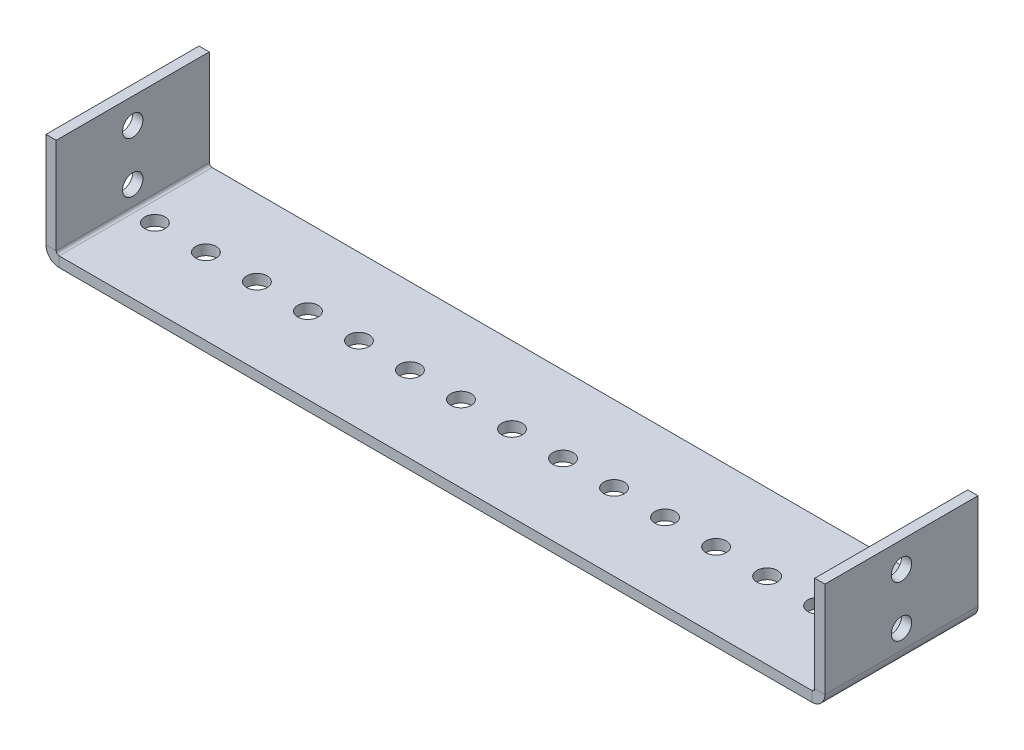
ISO-10303-21;
HEADER;
FILE_DESCRIPTION(('STEP AP214'),'2;1');
FILE_NAME('part.step','',(''),(''),'','','');
FILE_SCHEMA(('AUTOMOTIVE_DESIGN { 1 0 10303 214 1 1 1 1 }'));
ENDSEC;
DATA;
#1=APPLICATION_CONTEXT('core data for automotive mechanical design processes');
#2=APPLICATION_PROTOCOL_DEFINITION('international standard','automotive_design',2000,#1);
#3=PRODUCT_CONTEXT('',#1,'mechanical');
#4=PRODUCT('Part','Part','',(#3));
#5=PRODUCT_RELATED_PRODUCT_CATEGORY('part','',(#4));
#6=PRODUCT_DEFINITION_FORMATION('','',#4);
#7=PRODUCT_DEFINITION_CONTEXT('part definition',#1,'design');
#8=PRODUCT_DEFINITION('design','',#6,#7);
#9=PRODUCT_DEFINITION_SHAPE('','',#8);
#10=(LENGTH_UNIT() NAMED_UNIT(*) SI_UNIT(.MILLI.,.METRE.));
#11=(NAMED_UNIT(*) PLANE_ANGLE_UNIT() SI_UNIT($,.RADIAN.));
#12=(NAMED_UNIT(*) SI_UNIT($,.STERADIAN.) SOLID_ANGLE_UNIT());
#13=UNCERTAINTY_MEASURE_WITH_UNIT(LENGTH_MEASURE(1.E-05),#10,'distance_accuracy_value','');
#14=(GEOMETRIC_REPRESENTATION_CONTEXT(3) GLOBAL_UNCERTAINTY_ASSIGNED_CONTEXT((#13)) GLOBAL_UNIT_ASSIGNED_CONTEXT((#10,
#11,#12)) REPRESENTATION_CONTEXT('',''));
#15=CARTESIAN_POINT('',(0.,0.,0.));
#16=DIRECTION('',(0.,0.,1.));
#17=DIRECTION('',(1.,0.,0.));
#18=AXIS2_PLACEMENT_3D('',#15,#16,#17);
#19=CARTESIAN_POINT('',(-120.65,2.54,-19.05));
#20=DIRECTION('',(0.,0.,1.));
#21=DIRECTION('',(1.,0.,0.));
#22=AXIS2_PLACEMENT_3D('',#19,#20,#21);
#23=PLANE('',#22);
#24=DIRECTION('',(-1.,0.,0.));
#25=VECTOR('',#24,1.);
#26=CARTESIAN_POINT('',(-120.65,2.54,-19.05));
#27=LINE('',#26,#25);
#28=CARTESIAN_POINT('',(93.6740200453267,2.54,-19.05));
#29=VERTEX_POINT('',#28);
#30=CARTESIAN_POINT('',(-93.6740200453267,2.54,-19.05));
#31=VERTEX_POINT('',#30);
#32=EDGE_CURVE('E370',#29,#31,#27,.T.);
#33=ORIENTED_EDGE('',*,*,#32,.F.);
#34=DIRECTION('',(0.,-1.,0.));
#35=VECTOR('',#34,1.);
#36=CARTESIAN_POINT('',(93.6740200453267,2.54,-19.05));
#37=LINE('',#36,#35);
#38=CARTESIAN_POINT('',(93.6740200453266,0.,-19.05));
#39=VERTEX_POINT('',#38);
#40=EDGE_CURVE('E12',#29,#39,#37,.T.);
#41=ORIENTED_EDGE('',*,*,#40,.T.);
#42=DIRECTION('',(-1.,0.,0.));
#43=VECTOR('',#42,1.);
#44=CARTESIAN_POINT('',(-120.65,0.,-19.05));
#45=LINE('',#44,#43);
#46=CARTESIAN_POINT('',(-93.6740200453267,0.,-19.05));
#47=VERTEX_POINT('',#46);
#48=EDGE_CURVE('E219',#39,#47,#45,.T.);
#49=ORIENTED_EDGE('',*,*,#48,.T.);
#50=DIRECTION('',(0.,-1.,0.));
#51=VECTOR('',#50,1.);
#52=CARTESIAN_POINT('',(-93.6740200453267,2.54,-19.05));
#53=LINE('',#52,#51);
#54=EDGE_CURVE('E314',#31,#47,#53,.T.);
#55=ORIENTED_EDGE('',*,*,#54,.F.);
#56=EDGE_LOOP('',(#33,#41,#49,#55));
#57=FACE_BOUND('',#56,.T.);
#58=ADVANCED_FACE('F47',(#57),#23,.F.);
#59=CARTESIAN_POINT('',(-120.65,2.54,19.05));
#60=DIRECTION('',(0.,0.,-1.));
#61=DIRECTION('',(-1.,0.,0.));
#62=AXIS2_PLACEMENT_3D('',#59,#60,#61);
#63=PLANE('',#62);
#64=DIRECTION('',(1.,0.,0.));
#65=VECTOR('',#64,1.);
#66=CARTESIAN_POINT('',(-120.65,0.,19.05));
#67=LINE('',#66,#65);
#68=CARTESIAN_POINT('',(-93.6740200453267,0.,19.05));
#69=VERTEX_POINT('',#68);
#70=CARTESIAN_POINT('',(93.6740200453267,0.,19.05));
#71=VERTEX_POINT('',#70);
#72=EDGE_CURVE('E265',#69,#71,#67,.T.);
#73=ORIENTED_EDGE('',*,*,#72,.T.);
#74=DIRECTION('',(0.,1.,0.));
#75=VECTOR('',#74,1.);
#76=CARTESIAN_POINT('',(93.6740200453267,2.54,19.05));
#77=LINE('',#76,#75);
#78=CARTESIAN_POINT('',(93.6740200453267,2.54,19.05));
#79=VERTEX_POINT('',#78);
#80=EDGE_CURVE('E364',#71,#79,#77,.T.);
#81=ORIENTED_EDGE('',*,*,#80,.T.);
#82=DIRECTION('',(1.,0.,0.));
#83=VECTOR('',#82,1.);
#84=CARTESIAN_POINT('',(-120.65,2.54,19.05));
#85=LINE('',#84,#83);
#86=CARTESIAN_POINT('',(-93.6740200453267,2.54,19.05));
#87=VERTEX_POINT('',#86);
#88=EDGE_CURVE('E50',#87,#79,#85,.T.);
#89=ORIENTED_EDGE('',*,*,#88,.F.);
#90=DIRECTION('',(0.,1.,0.));
#91=VECTOR('',#90,1.);
#92=CARTESIAN_POINT('',(-93.6740200453267,2.54,19.05));
#93=LINE('',#92,#91);
#94=EDGE_CURVE('E311',#69,#87,#93,.T.);
#95=ORIENTED_EDGE('',*,*,#94,.F.);
#96=EDGE_LOOP('',(#73,#81,#89,#95));
#97=FACE_BOUND('',#96,.T.);
#98=ADVANCED_FACE('F379',(#97),#63,.F.);
#99=CARTESIAN_POINT('',(0.,2.54,0.));
#100=DIRECTION('',(0.,-1.,0.));
#101=DIRECTION('',(0.,0.,-1.));
#102=AXIS2_PLACEMENT_3D('',#99,#100,#101);
#103=PLANE('',#102);
#104=CARTESIAN_POINT('',(88.9,2.54,0.));
#105=DIRECTION('',(0.,1.,0.));
#106=DIRECTION('',(0.,0.,1.));
#107=AXIS2_PLACEMENT_3D('',#104,#105,#106);
#108=CIRCLE('',#107,2.54);
#109=CARTESIAN_POINT('',(88.9,2.54,2.54));
#110=VERTEX_POINT('',#109);
#111=EDGE_CURVE('E308',#110,#110,#108,.T.);
#112=ORIENTED_EDGE('',*,*,#111,.F.);
#113=EDGE_LOOP('',(#112));
#114=FACE_BOUND('',#113,.T.);
#115=CARTESIAN_POINT('',(76.2,2.54,0.));
#116=DIRECTION('',(0.,1.,0.));
#117=DIRECTION('',(0.,0.,1.));
#118=AXIS2_PLACEMENT_3D('',#115,#116,#117);
#119=CIRCLE('',#118,2.54);
#120=CARTESIAN_POINT('',(76.2,2.54,2.54));
#121=VERTEX_POINT('',#120);
#122=EDGE_CURVE('E305',#121,#121,#119,.T.);
#123=ORIENTED_EDGE('',*,*,#122,.F.);
#124=EDGE_LOOP('',(#123));
#125=FACE_BOUND('',#124,.T.);
#126=CARTESIAN_POINT('',(63.5,2.54,0.));
#127=DIRECTION('',(0.,1.,0.));
#128=DIRECTION('',(0.,0.,1.));
#129=AXIS2_PLACEMENT_3D('',#126,#127,#128);
#130=CIRCLE('',#129,2.54);
#131=CARTESIAN_POINT('',(63.5,2.54,2.54));
#132=VERTEX_POINT('',#131);
#133=EDGE_CURVE('E302',#132,#132,#130,.T.);
#134=ORIENTED_EDGE('',*,*,#133,.F.);
#135=EDGE_LOOP('',(#134));
#136=FACE_BOUND('',#135,.T.);
#137=CARTESIAN_POINT('',(50.8,2.54,0.));
#138=DIRECTION('',(0.,1.,0.));
#139=DIRECTION('',(0.,0.,1.));
#140=AXIS2_PLACEMENT_3D('',#137,#138,#139);
#141=CIRCLE('',#140,2.54);
#142=CARTESIAN_POINT('',(50.8,2.54,2.54));
#143=VERTEX_POINT('',#142);
#144=EDGE_CURVE('E299',#143,#143,#141,.T.);
#145=ORIENTED_EDGE('',*,*,#144,.F.);
#146=EDGE_LOOP('',(#145));
#147=FACE_BOUND('',#146,.T.);
#148=CARTESIAN_POINT('',(38.1,2.54,0.));
#149=DIRECTION('',(0.,1.,0.));
#150=DIRECTION('',(0.,0.,1.));
#151=AXIS2_PLACEMENT_3D('',#148,#149,#150);
#152=CIRCLE('',#151,2.54);
#153=CARTESIAN_POINT('',(38.1,2.54,2.54));
#154=VERTEX_POINT('',#153);
#155=EDGE_CURVE('E296',#154,#154,#152,.T.);
#156=ORIENTED_EDGE('',*,*,#155,.F.);
#157=EDGE_LOOP('',(#156));
#158=FACE_BOUND('',#157,.T.);
#159=CARTESIAN_POINT('',(25.4,2.54,0.));
#160=DIRECTION('',(0.,1.,0.));
#161=DIRECTION('',(0.,0.,1.));
#162=AXIS2_PLACEMENT_3D('',#159,#160,#161);
#163=CIRCLE('',#162,2.54);
#164=CARTESIAN_POINT('',(25.4,2.54,2.54));
#165=VERTEX_POINT('',#164);
#166=EDGE_CURVE('E293',#165,#165,#163,.T.);
#167=ORIENTED_EDGE('',*,*,#166,.F.);
#168=EDGE_LOOP('',(#167));
#169=FACE_BOUND('',#168,.T.);
#170=CARTESIAN_POINT('',(12.7,2.54,0.));
#171=DIRECTION('',(0.,1.,0.));
#172=DIRECTION('',(0.,0.,1.));
#173=AXIS2_PLACEMENT_3D('',#170,#171,#172);
#174=CIRCLE('',#173,2.54);
#175=CARTESIAN_POINT('',(12.7,2.54,2.54));
#176=VERTEX_POINT('',#175);
#177=EDGE_CURVE('E290',#176,#176,#174,.T.);
#178=ORIENTED_EDGE('',*,*,#177,.F.);
#179=EDGE_LOOP('',(#178));
#180=FACE_BOUND('',#179,.T.);
#181=CARTESIAN_POINT('',(0.,2.54,0.));
#182=DIRECTION('',(0.,1.,0.));
#183=DIRECTION('',(0.,0.,1.));
#184=AXIS2_PLACEMENT_3D('',#181,#182,#183);
#185=CIRCLE('',#184,2.54);
#186=CARTESIAN_POINT('',(0.,2.54,2.54));
#187=VERTEX_POINT('',#186);
#188=EDGE_CURVE('E287',#187,#187,#185,.T.);
#189=ORIENTED_EDGE('',*,*,#188,.F.);
#190=EDGE_LOOP('',(#189));
#191=FACE_BOUND('',#190,.T.);
#192=CARTESIAN_POINT('',(-12.7,2.54,0.));
#193=DIRECTION('',(0.,1.,0.));
#194=DIRECTION('',(0.,0.,1.));
#195=AXIS2_PLACEMENT_3D('',#192,#193,#194);
#196=CIRCLE('',#195,2.54);
#197=CARTESIAN_POINT('',(-12.7,2.54,2.54));
#198=VERTEX_POINT('',#197);
#199=EDGE_CURVE('E284',#198,#198,#196,.T.);
#200=ORIENTED_EDGE('',*,*,#199,.F.);
#201=EDGE_LOOP('',(#200));
#202=FACE_BOUND('',#201,.T.);
#203=CARTESIAN_POINT('',(-25.4,2.54,0.));
#204=DIRECTION('',(0.,1.,0.));
#205=DIRECTION('',(0.,0.,1.));
#206=AXIS2_PLACEMENT_3D('',#203,#204,#205);
#207=CIRCLE('',#206,2.54);
#208=CARTESIAN_POINT('',(-25.4,2.54,2.54));
#209=VERTEX_POINT('',#208);
#210=EDGE_CURVE('E281',#209,#209,#207,.T.);
#211=ORIENTED_EDGE('',*,*,#210,.F.);
#212=EDGE_LOOP('',(#211));
#213=FACE_BOUND('',#212,.T.);
#214=CARTESIAN_POINT('',(-38.1,2.54,0.));
#215=DIRECTION('',(0.,1.,0.));
#216=DIRECTION('',(0.,0.,1.));
#217=AXIS2_PLACEMENT_3D('',#214,#215,#216);
#218=CIRCLE('',#217,2.54);
#219=CARTESIAN_POINT('',(-38.1,2.54,2.54));
#220=VERTEX_POINT('',#219);
#221=EDGE_CURVE('E278',#220,#220,#218,.T.);
#222=ORIENTED_EDGE('',*,*,#221,.F.);
#223=EDGE_LOOP('',(#222));
#224=FACE_BOUND('',#223,.T.);
#225=CARTESIAN_POINT('',(-50.8,2.54,0.));
#226=DIRECTION('',(0.,1.,0.));
#227=DIRECTION('',(0.,0.,1.));
#228=AXIS2_PLACEMENT_3D('',#225,#226,#227);
#229=CIRCLE('',#228,2.54);
#230=CARTESIAN_POINT('',(-50.8,2.54,2.54));
#231=VERTEX_POINT('',#230);
#232=EDGE_CURVE('E275',#231,#231,#229,.T.);
#233=ORIENTED_EDGE('',*,*,#232,.F.);
#234=EDGE_LOOP('',(#233));
#235=FACE_BOUND('',#234,.T.);
#236=CARTESIAN_POINT('',(-63.5,2.54,0.));
#237=DIRECTION('',(0.,1.,0.));
#238=DIRECTION('',(0.,0.,1.));
#239=AXIS2_PLACEMENT_3D('',#236,#237,#238);
#240=CIRCLE('',#239,2.54);
#241=CARTESIAN_POINT('',(-63.5,2.54,2.54));
#242=VERTEX_POINT('',#241);
#243=EDGE_CURVE('E272',#242,#242,#240,.T.);
#244=ORIENTED_EDGE('',*,*,#243,.F.);
#245=EDGE_LOOP('',(#244));
#246=FACE_BOUND('',#245,.T.);
#247=CARTESIAN_POINT('',(-76.2,2.54,0.));
#248=DIRECTION('',(0.,1.,0.));
#249=DIRECTION('',(0.,0.,1.));
#250=AXIS2_PLACEMENT_3D('',#247,#248,#249);
#251=CIRCLE('',#250,2.54);
#252=CARTESIAN_POINT('',(-76.2,2.54,2.54));
#253=VERTEX_POINT('',#252);
#254=EDGE_CURVE('E269',#253,#253,#251,.T.);
#255=ORIENTED_EDGE('',*,*,#254,.F.);
#256=EDGE_LOOP('',(#255));
#257=FACE_BOUND('',#256,.T.);
#258=CARTESIAN_POINT('',(-88.9,2.54,0.));
#259=DIRECTION('',(0.,1.,0.));
#260=DIRECTION('',(0.,0.,1.));
#261=AXIS2_PLACEMENT_3D('',#258,#259,#260);
#262=CIRCLE('',#261,2.54);
#263=CARTESIAN_POINT('',(-88.9,2.54,2.54));
#264=VERTEX_POINT('',#263);
#265=EDGE_CURVE('E266',#264,#264,#262,.T.);
#266=ORIENTED_EDGE('',*,*,#265,.F.);
#267=EDGE_LOOP('',(#266));
#268=FACE_BOUND('',#267,.T.);
#269=ORIENTED_EDGE('',*,*,#88,.T.);
#270=DIRECTION('',(0.,0.,-1.));
#271=VECTOR('',#270,1.);
#272=CARTESIAN_POINT('',(93.6740200453267,2.54,0.));
#273=LINE('',#272,#271);
#274=EDGE_CURVE('E355',#79,#29,#273,.T.);
#275=ORIENTED_EDGE('',*,*,#274,.T.);
#276=ORIENTED_EDGE('',*,*,#32,.T.);
#277=DIRECTION('',(0.,0.,-1.));
#278=VECTOR('',#277,1.);
#279=CARTESIAN_POINT('',(-93.6740200453267,2.54,0.));
#280=LINE('',#279,#278);
#281=EDGE_CURVE('E212',#87,#31,#280,.T.);
#282=ORIENTED_EDGE('',*,*,#281,.F.);
#283=EDGE_LOOP('',(#269,#275,#276,#282));
#284=FACE_BOUND('',#283,.T.);
#285=ADVANCED_FACE('F376',(#114,#125,#136,#147,#158,#169,#180,#191,#202,#213,#224,#235,#246,
#257,#268,#284),#103,.F.);
#286=CARTESIAN_POINT('',(-94.410620045327,-93.5493799546733,0.));
#287=DIRECTION('',(-1.,0.,0.));
#288=DIRECTION('',(0.,0.,-1.));
#289=AXIS2_PLACEMENT_3D('',#286,#287,#288);
#290=PLANE('',#289);
#291=CARTESIAN_POINT('',(-94.4106200453266,20.7506200453267,0.));
#292=DIRECTION('',(1.,0.,0.));
#293=DIRECTION('',(0.,0.,1.));
#294=AXIS2_PLACEMENT_3D('',#291,#292,#293);
#295=CIRCLE('',#294,2.54);
#296=CARTESIAN_POINT('',(-94.4106200453266,20.7506200453267,2.54));
#297=VERTEX_POINT('',#296);
#298=EDGE_CURVE('E325',#297,#297,#295,.T.);
#299=ORIENTED_EDGE('',*,*,#298,.F.);
#300=EDGE_LOOP('',(#299));
#301=FACE_BOUND('',#300,.T.);
#302=CARTESIAN_POINT('',(-94.4106200453267,8.05062004532668,0.));
#303=DIRECTION('',(1.,0.,0.));
#304=DIRECTION('',(0.,0.,1.));
#305=AXIS2_PLACEMENT_3D('',#302,#303,#304);
#306=CIRCLE('',#305,2.54);
#307=CARTESIAN_POINT('',(-94.4106200453267,8.05062004532668,2.54));
#308=VERTEX_POINT('',#307);
#309=EDGE_CURVE('E322',#308,#308,#306,.T.);
#310=ORIENTED_EDGE('',*,*,#309,.F.);
#311=EDGE_LOOP('',(#310));
#312=FACE_BOUND('',#311,.T.);
#313=DIRECTION('',(0.,-1.,0.));
#314=VECTOR('',#313,1.);
#315=CARTESIAN_POINT('',(-94.4106200453266,27.1006200453267,19.05));
#316=LINE('',#315,#314);
#317=CARTESIAN_POINT('',(-94.4106200453266,27.1006200453267,19.05));
#318=VERTEX_POINT('',#317);
#319=CARTESIAN_POINT('',(-94.4106200453267,3.2766,19.05));
#320=VERTEX_POINT('',#319);
#321=EDGE_CURVE('E334',#318,#320,#316,.T.);
#322=ORIENTED_EDGE('',*,*,#321,.T.);
#323=DIRECTION('',(0.,0.,-1.));
#324=VECTOR('',#323,1.);
#325=CARTESIAN_POINT('',(-94.4106200453267,3.2766,0.));
#326=LINE('',#325,#324);
#327=CARTESIAN_POINT('',(-94.4106200453267,3.2766,-19.05));
#328=VERTEX_POINT('',#327);
#329=EDGE_CURVE('E345',#320,#328,#326,.T.);
#330=ORIENTED_EDGE('',*,*,#329,.T.);
#331=DIRECTION('',(0.,1.,0.));
#332=VECTOR('',#331,1.);
#333=CARTESIAN_POINT('',(-94.4106200453266,27.1006200453267,-19.05));
#334=LINE('',#333,#332);
#335=CARTESIAN_POINT('',(-94.4106200453266,27.1006200453267,-19.05));
#336=VERTEX_POINT('',#335);
#337=EDGE_CURVE('E335',#328,#336,#334,.T.);
#338=ORIENTED_EDGE('',*,*,#337,.T.);
#339=DIRECTION('',(0.,0.,1.));
#340=VECTOR('',#339,1.);
#341=CARTESIAN_POINT('',(-94.4106200453266,27.1006200453267,19.05));
#342=LINE('',#341,#340);
#343=EDGE_CURVE('E332',#336,#318,#342,.T.);
#344=ORIENTED_EDGE('',*,*,#343,.T.);
#345=EDGE_LOOP('',(#322,#330,#338,#344));
#346=FACE_BOUND('',#345,.T.);
#347=ADVANCED_FACE('F426',(#301,#312,#346),#290,.F.);
#348=CARTESIAN_POINT('',(-94.4106200453266,27.1006200453267,19.05));
#349=DIRECTION('',(0.,0.,-1.));
#350=DIRECTION('',(0.,1.,0.));
#351=AXIS2_PLACEMENT_3D('',#348,#349,#350);
#352=PLANE('',#351);
#353=DIRECTION('',(0.,-1.,0.));
#354=VECTOR('',#353,1.);
#355=CARTESIAN_POINT('',(-96.9506200453266,27.1006200453267,19.05));
#356=LINE('',#355,#354);
#357=CARTESIAN_POINT('',(-96.9506200453266,27.1006200453267,19.05));
#358=VERTEX_POINT('',#357);
#359=CARTESIAN_POINT('',(-96.9506200453267,3.27659999999999,19.05));
#360=VERTEX_POINT('',#359);
#361=EDGE_CURVE('E338',#358,#360,#356,.T.);
#362=ORIENTED_EDGE('',*,*,#361,.T.);
#363=DIRECTION('',(1.,0.,0.));
#364=VECTOR('',#363,1.);
#365=CARTESIAN_POINT('',(-94.4106200453267,3.2766,19.05));
#366=LINE('',#365,#364);
#367=EDGE_CURVE('E348',#360,#320,#366,.T.);
#368=ORIENTED_EDGE('',*,*,#367,.T.);
#369=ORIENTED_EDGE('',*,*,#321,.F.);
#370=DIRECTION('',(-1.,0.,0.));
#371=VECTOR('',#370,1.);
#372=CARTESIAN_POINT('',(-94.4106200453266,27.1006200453267,19.05));
#373=LINE('',#372,#371);
#374=EDGE_CURVE('E339',#318,#358,#373,.T.);
#375=ORIENTED_EDGE('',*,*,#374,.T.);
#376=EDGE_LOOP('',(#362,#368,#369,#375));
#377=FACE_BOUND('',#376,.T.);
#378=ADVANCED_FACE('F430',(#377),#352,.F.);
#379=CARTESIAN_POINT('',(-94.4106200453266,27.1006200453267,-19.05));
#380=DIRECTION('',(0.,0.,1.));
#381=DIRECTION('',(0.,-1.,0.));
#382=AXIS2_PLACEMENT_3D('',#379,#380,#381);
#383=PLANE('',#382);
#384=ORIENTED_EDGE('',*,*,#337,.F.);
#385=DIRECTION('',(-1.,0.,0.));
#386=VECTOR('',#385,1.);
#387=CARTESIAN_POINT('',(-94.4106200453267,3.2766,-19.05));
#388=LINE('',#387,#386);
#389=CARTESIAN_POINT('',(-96.9506200453267,3.27660000000002,-19.05));
#390=VERTEX_POINT('',#389);
#391=EDGE_CURVE('E352',#328,#390,#388,.T.);
#392=ORIENTED_EDGE('',*,*,#391,.T.);
#393=DIRECTION('',(0.,1.,0.));
#394=VECTOR('',#393,1.);
#395=CARTESIAN_POINT('',(-96.9506200453266,27.1006200453267,-19.05));
#396=LINE('',#395,#394);
#397=CARTESIAN_POINT('',(-96.9506200453266,27.1006200453267,-19.05));
#398=VERTEX_POINT('',#397);
#399=EDGE_CURVE('E329',#390,#398,#396,.T.);
#400=ORIENTED_EDGE('',*,*,#399,.T.);
#401=DIRECTION('',(-1.,0.,0.));
#402=VECTOR('',#401,1.);
#403=CARTESIAN_POINT('',(-94.4106200453266,27.1006200453267,-19.05));
#404=LINE('',#403,#402);
#405=EDGE_CURVE('E342',#336,#398,#404,.T.);
#406=ORIENTED_EDGE('',*,*,#405,.F.);
#407=EDGE_LOOP('',(#384,#392,#400,#406));
#408=FACE_BOUND('',#407,.T.);
#409=ADVANCED_FACE('F422',(#408),#383,.F.);
#410=CARTESIAN_POINT('',(-94.4106200453266,27.1006200453267,19.05));
#411=DIRECTION('',(0.,-1.,0.));
#412=DIRECTION('',(0.,0.,-1.));
#413=AXIS2_PLACEMENT_3D('',#410,#411,#412);
#414=PLANE('',#413);
#415=DIRECTION('',(0.,0.,1.));
#416=VECTOR('',#415,1.);
#417=CARTESIAN_POINT('',(-96.9506200453266,27.1006200453267,19.05));
#418=LINE('',#417,#416);
#419=EDGE_CURVE('E336',#398,#358,#418,.T.);
#420=ORIENTED_EDGE('',*,*,#419,.T.);
#421=ORIENTED_EDGE('',*,*,#374,.F.);
#422=ORIENTED_EDGE('',*,*,#343,.F.);
#423=ORIENTED_EDGE('',*,*,#405,.T.);
#424=EDGE_LOOP('',(#420,#421,#422,#423));
#425=FACE_BOUND('',#424,.T.);
#426=ADVANCED_FACE('F490',(#425),#414,.F.);
#427=CARTESIAN_POINT('',(-96.950620045327,-93.5493799546733,0.));
#428=DIRECTION('',(-1.,0.,0.));
#429=DIRECTION('',(0.,0.,-1.));
#430=AXIS2_PLACEMENT_3D('',#427,#428,#429);
#431=PLANE('',#430);
#432=DIRECTION('',(0.,0.,-1.));
#433=VECTOR('',#432,1.);
#434=CARTESIAN_POINT('',(-96.9506200453267,3.27660000000002,0.));
#435=LINE('',#434,#433);
#436=EDGE_CURVE('E71',#360,#390,#435,.T.);
#437=ORIENTED_EDGE('',*,*,#436,.F.);
#438=ORIENTED_EDGE('',*,*,#361,.F.);
#439=ORIENTED_EDGE('',*,*,#419,.F.);
#440=ORIENTED_EDGE('',*,*,#399,.F.);
#441=EDGE_LOOP('',(#437,#438,#439,#440));
#442=FACE_BOUND('',#441,.T.);
#443=CARTESIAN_POINT('',(-96.9506200453266,8.0506200453267,0.));
#444=DIRECTION('',(1.,0.,0.));
#445=DIRECTION('',(0.,0.,1.));
#446=AXIS2_PLACEMENT_3D('',#443,#444,#445);
#447=CIRCLE('',#446,2.54);
#448=CARTESIAN_POINT('',(-96.9506200453266,8.0506200453267,2.54));
#449=VERTEX_POINT('',#448);
#450=EDGE_CURVE('E319',#449,#449,#447,.T.);
#451=ORIENTED_EDGE('',*,*,#450,.T.);
#452=EDGE_LOOP('',(#451));
#453=FACE_BOUND('',#452,.T.);
#454=CARTESIAN_POINT('',(-96.9506200453266,20.7506200453267,0.));
#455=DIRECTION('',(1.,0.,0.));
#456=DIRECTION('',(0.,0.,1.));
#457=AXIS2_PLACEMENT_3D('',#454,#455,#456);
#458=CIRCLE('',#457,2.54);
#459=CARTESIAN_POINT('',(-96.9506200453266,20.7506200453267,2.54));
#460=VERTEX_POINT('',#459);
#461=EDGE_CURVE('E326',#460,#460,#458,.T.);
#462=ORIENTED_EDGE('',*,*,#461,.T.);
#463=EDGE_LOOP('',(#462));
#464=FACE_BOUND('',#463,.T.);
#465=ADVANCED_FACE('F491',(#442,#453,#464),#431,.T.);
#466=CARTESIAN_POINT('',(-96.9506200453266,20.7506200453267,0.));
#467=DIRECTION('',(1.,0.,0.));
#468=DIRECTION('',(0.,0.,1.));
#469=AXIS2_PLACEMENT_3D('',#466,#467,#468);
#470=CYLINDRICAL_SURFACE('',#469,2.54);
#471=ORIENTED_EDGE('',*,*,#461,.F.);
#472=EDGE_LOOP('',(#471));
#473=FACE_BOUND('',#472,.T.);
#474=ORIENTED_EDGE('',*,*,#298,.T.);
#475=EDGE_LOOP('',(#474));
#476=FACE_BOUND('',#475,.T.);
#477=ADVANCED_FACE('F494',(#473,#476),#470,.F.);
#478=CARTESIAN_POINT('',(-96.9506200453266,8.0506200453267,0.));
#479=DIRECTION('',(1.,0.,0.));
#480=DIRECTION('',(0.,0.,1.));
#481=AXIS2_PLACEMENT_3D('',#478,#479,#480);
#482=CYLINDRICAL_SURFACE('',#481,2.54);
#483=ORIENTED_EDGE('',*,*,#450,.F.);
#484=EDGE_LOOP('',(#483));
#485=FACE_BOUND('',#484,.T.);
#486=ORIENTED_EDGE('',*,*,#309,.T.);
#487=EDGE_LOOP('',(#486));
#488=FACE_BOUND('',#487,.T.);
#489=ADVANCED_FACE('F503',(#485,#488),#482,.F.);
#490=CARTESIAN_POINT('',(88.9,0.,0.));
#491=DIRECTION('',(0.,1.,0.));
#492=DIRECTION('',(0.,0.,1.));
#493=AXIS2_PLACEMENT_3D('',#490,#491,#492);
#494=CYLINDRICAL_SURFACE('',#493,2.54);
#495=CARTESIAN_POINT('',(88.9,0.,0.));
#496=DIRECTION('',(0.,1.,0.));
#497=DIRECTION('',(0.,0.,1.));
#498=AXIS2_PLACEMENT_3D('',#495,#496,#497);
#499=CIRCLE('',#498,2.54);
#500=CARTESIAN_POINT('',(88.9,0.,2.54));
#501=VERTEX_POINT('',#500);
#502=EDGE_CURVE('E262',#501,#501,#499,.T.);
#503=ORIENTED_EDGE('',*,*,#502,.F.);
#504=EDGE_LOOP('',(#503));
#505=FACE_BOUND('',#504,.T.);
#506=ORIENTED_EDGE('',*,*,#111,.T.);
#507=EDGE_LOOP('',(#506));
#508=FACE_BOUND('',#507,.T.);
#509=ADVANCED_FACE('F506',(#505,#508),#494,.F.);
#510=CARTESIAN_POINT('',(76.2,0.,0.));
#511=DIRECTION('',(0.,1.,0.));
#512=DIRECTION('',(0.,0.,1.));
#513=AXIS2_PLACEMENT_3D('',#510,#511,#512);
#514=CYLINDRICAL_SURFACE('',#513,2.54);
#515=CARTESIAN_POINT('',(76.2,0.,0.));
#516=DIRECTION('',(0.,1.,0.));
#517=DIRECTION('',(0.,0.,1.));
#518=AXIS2_PLACEMENT_3D('',#515,#516,#517);
#519=CIRCLE('',#518,2.54);
#520=CARTESIAN_POINT('',(76.2,0.,2.54));
#521=VERTEX_POINT('',#520);
#522=EDGE_CURVE('E259',#521,#521,#519,.T.);
#523=ORIENTED_EDGE('',*,*,#522,.F.);
#524=EDGE_LOOP('',(#523));
#525=FACE_BOUND('',#524,.T.);
#526=ORIENTED_EDGE('',*,*,#122,.T.);
#527=EDGE_LOOP('',(#526));
#528=FACE_BOUND('',#527,.T.);
#529=ADVANCED_FACE('F555',(#525,#528),#514,.F.);
#530=CARTESIAN_POINT('',(63.5,0.,0.));
#531=DIRECTION('',(0.,1.,0.));
#532=DIRECTION('',(0.,0.,1.));
#533=AXIS2_PLACEMENT_3D('',#530,#531,#532);
#534=CYLINDRICAL_SURFACE('',#533,2.54);
#535=CARTESIAN_POINT('',(63.5,0.,0.));
#536=DIRECTION('',(0.,1.,0.));
#537=DIRECTION('',(0.,0.,1.));
#538=AXIS2_PLACEMENT_3D('',#535,#536,#537);
#539=CIRCLE('',#538,2.54);
#540=CARTESIAN_POINT('',(63.5,0.,2.54));
#541=VERTEX_POINT('',#540);
#542=EDGE_CURVE('E256',#541,#541,#539,.T.);
#543=ORIENTED_EDGE('',*,*,#542,.F.);
#544=EDGE_LOOP('',(#543));
#545=FACE_BOUND('',#544,.T.);
#546=ORIENTED_EDGE('',*,*,#133,.T.);
#547=EDGE_LOOP('',(#546));
#548=FACE_BOUND('',#547,.T.);
#549=ADVANCED_FACE('F551',(#545,#548),#534,.F.);
#550=CARTESIAN_POINT('',(50.8,0.,0.));
#551=DIRECTION('',(0.,1.,0.));
#552=DIRECTION('',(0.,0.,1.));
#553=AXIS2_PLACEMENT_3D('',#550,#551,#552);
#554=CYLINDRICAL_SURFACE('',#553,2.54);
#555=CARTESIAN_POINT('',(50.8,0.,0.));
#556=DIRECTION('',(0.,1.,0.));
#557=DIRECTION('',(0.,0.,1.));
#558=AXIS2_PLACEMENT_3D('',#555,#556,#557);
#559=CIRCLE('',#558,2.54);
#560=CARTESIAN_POINT('',(50.8,0.,2.54));
#561=VERTEX_POINT('',#560);
#562=EDGE_CURVE('E253',#561,#561,#559,.T.);
#563=ORIENTED_EDGE('',*,*,#562,.F.);
#564=EDGE_LOOP('',(#563));
#565=FACE_BOUND('',#564,.T.);
#566=ORIENTED_EDGE('',*,*,#144,.T.);
#567=EDGE_LOOP('',(#566));
#568=FACE_BOUND('',#567,.T.);
#569=ADVANCED_FACE('F547',(#565,#568),#554,.F.);
#570=CARTESIAN_POINT('',(38.1,0.,0.));
#571=DIRECTION('',(0.,1.,0.));
#572=DIRECTION('',(0.,0.,1.));
#573=AXIS2_PLACEMENT_3D('',#570,#571,#572);
#574=CYLINDRICAL_SURFACE('',#573,2.54);
#575=CARTESIAN_POINT('',(38.1,0.,0.));
#576=DIRECTION('',(0.,1.,0.));
#577=DIRECTION('',(0.,0.,1.));
#578=AXIS2_PLACEMENT_3D('',#575,#576,#577);
#579=CIRCLE('',#578,2.54);
#580=CARTESIAN_POINT('',(38.1,0.,2.54));
#581=VERTEX_POINT('',#580);
#582=EDGE_CURVE('E250',#581,#581,#579,.T.);
#583=ORIENTED_EDGE('',*,*,#582,.F.);
#584=EDGE_LOOP('',(#583));
#585=FACE_BOUND('',#584,.T.);
#586=ORIENTED_EDGE('',*,*,#155,.T.);
#587=EDGE_LOOP('',(#586));
#588=FACE_BOUND('',#587,.T.);
#589=ADVANCED_FACE('F543',(#585,#588),#574,.F.);
#590=CARTESIAN_POINT('',(25.4,0.,0.));
#591=DIRECTION('',(0.,1.,0.));
#592=DIRECTION('',(0.,0.,1.));
#593=AXIS2_PLACEMENT_3D('',#590,#591,#592);
#594=CYLINDRICAL_SURFACE('',#593,2.54);
#595=CARTESIAN_POINT('',(25.4,0.,0.));
#596=DIRECTION('',(0.,1.,0.));
#597=DIRECTION('',(0.,0.,1.));
#598=AXIS2_PLACEMENT_3D('',#595,#596,#597);
#599=CIRCLE('',#598,2.54);
#600=CARTESIAN_POINT('',(25.4,0.,2.54));
#601=VERTEX_POINT('',#600);
#602=EDGE_CURVE('E247',#601,#601,#599,.T.);
#603=ORIENTED_EDGE('',*,*,#602,.F.);
#604=EDGE_LOOP('',(#603));
#605=FACE_BOUND('',#604,.T.);
#606=ORIENTED_EDGE('',*,*,#166,.T.);
#607=EDGE_LOOP('',(#606));
#608=FACE_BOUND('',#607,.T.);
#609=ADVANCED_FACE('F539',(#605,#608),#594,.F.);
#610=CARTESIAN_POINT('',(12.7,0.,0.));
#611=DIRECTION('',(0.,1.,0.));
#612=DIRECTION('',(0.,0.,1.));
#613=AXIS2_PLACEMENT_3D('',#610,#611,#612);
#614=CYLINDRICAL_SURFACE('',#613,2.54);
#615=CARTESIAN_POINT('',(12.7,0.,0.));
#616=DIRECTION('',(0.,1.,0.));
#617=DIRECTION('',(0.,0.,1.));
#618=AXIS2_PLACEMENT_3D('',#615,#616,#617);
#619=CIRCLE('',#618,2.54);
#620=CARTESIAN_POINT('',(12.7,0.,2.54));
#621=VERTEX_POINT('',#620);
#622=EDGE_CURVE('E244',#621,#621,#619,.T.);
#623=ORIENTED_EDGE('',*,*,#622,.F.);
#624=EDGE_LOOP('',(#623));
#625=FACE_BOUND('',#624,.T.);
#626=ORIENTED_EDGE('',*,*,#177,.T.);
#627=EDGE_LOOP('',(#626));
#628=FACE_BOUND('',#627,.T.);
#629=ADVANCED_FACE('F535',(#625,#628),#614,.F.);
#630=CARTESIAN_POINT('',(0.,0.,0.));
#631=DIRECTION('',(0.,1.,0.));
#632=DIRECTION('',(0.,0.,1.));
#633=AXIS2_PLACEMENT_3D('',#630,#631,#632);
#634=CYLINDRICAL_SURFACE('',#633,2.54);
#635=CARTESIAN_POINT('',(0.,0.,0.));
#636=DIRECTION('',(0.,1.,0.));
#637=DIRECTION('',(0.,0.,1.));
#638=AXIS2_PLACEMENT_3D('',#635,#636,#637);
#639=CIRCLE('',#638,2.54);
#640=CARTESIAN_POINT('',(0.,0.,2.54));
#641=VERTEX_POINT('',#640);
#642=EDGE_CURVE('E241',#641,#641,#639,.T.);
#643=ORIENTED_EDGE('',*,*,#642,.F.);
#644=EDGE_LOOP('',(#643));
#645=FACE_BOUND('',#644,.T.);
#646=ORIENTED_EDGE('',*,*,#188,.T.);
#647=EDGE_LOOP('',(#646));
#648=FACE_BOUND('',#647,.T.);
#649=ADVANCED_FACE('F531',(#645,#648),#634,.F.);
#650=CARTESIAN_POINT('',(-12.7,0.,0.));
#651=DIRECTION('',(0.,1.,0.));
#652=DIRECTION('',(0.,0.,1.));
#653=AXIS2_PLACEMENT_3D('',#650,#651,#652);
#654=CYLINDRICAL_SURFACE('',#653,2.54);
#655=CARTESIAN_POINT('',(-12.7,0.,0.));
#656=DIRECTION('',(0.,1.,0.));
#657=DIRECTION('',(0.,0.,1.));
#658=AXIS2_PLACEMENT_3D('',#655,#656,#657);
#659=CIRCLE('',#658,2.54);
#660=CARTESIAN_POINT('',(-12.7,0.,2.54));
#661=VERTEX_POINT('',#660);
#662=EDGE_CURVE('E238',#661,#661,#659,.T.);
#663=ORIENTED_EDGE('',*,*,#662,.F.);
#664=EDGE_LOOP('',(#663));
#665=FACE_BOUND('',#664,.T.);
#666=ORIENTED_EDGE('',*,*,#199,.T.);
#667=EDGE_LOOP('',(#666));
#668=FACE_BOUND('',#667,.T.);
#669=ADVANCED_FACE('F527',(#665,#668),#654,.F.);
#670=CARTESIAN_POINT('',(-25.4,0.,0.));
#671=DIRECTION('',(0.,1.,0.));
#672=DIRECTION('',(0.,0.,1.));
#673=AXIS2_PLACEMENT_3D('',#670,#671,#672);
#674=CYLINDRICAL_SURFACE('',#673,2.54);
#675=CARTESIAN_POINT('',(-25.4,0.,0.));
#676=DIRECTION('',(0.,1.,0.));
#677=DIRECTION('',(0.,0.,1.));
#678=AXIS2_PLACEMENT_3D('',#675,#676,#677);
#679=CIRCLE('',#678,2.54);
#680=CARTESIAN_POINT('',(-25.4,0.,2.54));
#681=VERTEX_POINT('',#680);
#682=EDGE_CURVE('E235',#681,#681,#679,.T.);
#683=ORIENTED_EDGE('',*,*,#682,.F.);
#684=EDGE_LOOP('',(#683));
#685=FACE_BOUND('',#684,.T.);
#686=ORIENTED_EDGE('',*,*,#210,.T.);
#687=EDGE_LOOP('',(#686));
#688=FACE_BOUND('',#687,.T.);
#689=ADVANCED_FACE('F523',(#685,#688),#674,.F.);
#690=CARTESIAN_POINT('',(-38.1,0.,0.));
#691=DIRECTION('',(0.,1.,0.));
#692=DIRECTION('',(0.,0.,1.));
#693=AXIS2_PLACEMENT_3D('',#690,#691,#692);
#694=CYLINDRICAL_SURFACE('',#693,2.54);
#695=CARTESIAN_POINT('',(-38.1,0.,0.));
#696=DIRECTION('',(0.,1.,0.));
#697=DIRECTION('',(0.,0.,1.));
#698=AXIS2_PLACEMENT_3D('',#695,#696,#697);
#699=CIRCLE('',#698,2.54);
#700=CARTESIAN_POINT('',(-38.1,0.,2.54));
#701=VERTEX_POINT('',#700);
#702=EDGE_CURVE('E232',#701,#701,#699,.T.);
#703=ORIENTED_EDGE('',*,*,#702,.F.);
#704=EDGE_LOOP('',(#703));
#705=FACE_BOUND('',#704,.T.);
#706=ORIENTED_EDGE('',*,*,#221,.T.);
#707=EDGE_LOOP('',(#706));
#708=FACE_BOUND('',#707,.T.);
#709=ADVANCED_FACE('F519',(#705,#708),#694,.F.);
#710=CARTESIAN_POINT('',(-50.8,0.,0.));
#711=DIRECTION('',(0.,1.,0.));
#712=DIRECTION('',(0.,0.,1.));
#713=AXIS2_PLACEMENT_3D('',#710,#711,#712);
#714=CYLINDRICAL_SURFACE('',#713,2.54);
#715=CARTESIAN_POINT('',(-50.8,0.,0.));
#716=DIRECTION('',(0.,1.,0.));
#717=DIRECTION('',(0.,0.,1.));
#718=AXIS2_PLACEMENT_3D('',#715,#716,#717);
#719=CIRCLE('',#718,2.54);
#720=CARTESIAN_POINT('',(-50.8,0.,2.54));
#721=VERTEX_POINT('',#720);
#722=EDGE_CURVE('E229',#721,#721,#719,.T.);
#723=ORIENTED_EDGE('',*,*,#722,.F.);
#724=EDGE_LOOP('',(#723));
#725=FACE_BOUND('',#724,.T.);
#726=ORIENTED_EDGE('',*,*,#232,.T.);
#727=EDGE_LOOP('',(#726));
#728=FACE_BOUND('',#727,.T.);
#729=ADVANCED_FACE('F515',(#725,#728),#714,.F.);
#730=CARTESIAN_POINT('',(-63.5,0.,0.));
#731=DIRECTION('',(0.,1.,0.));
#732=DIRECTION('',(0.,0.,1.));
#733=AXIS2_PLACEMENT_3D('',#730,#731,#732);
#734=CYLINDRICAL_SURFACE('',#733,2.54);
#735=CARTESIAN_POINT('',(-63.5,0.,0.));
#736=DIRECTION('',(0.,1.,0.));
#737=DIRECTION('',(0.,0.,1.));
#738=AXIS2_PLACEMENT_3D('',#735,#736,#737);
#739=CIRCLE('',#738,2.54);
#740=CARTESIAN_POINT('',(-63.5,0.,2.54));
#741=VERTEX_POINT('',#740);
#742=EDGE_CURVE('E226',#741,#741,#739,.T.);
#743=ORIENTED_EDGE('',*,*,#742,.F.);
#744=EDGE_LOOP('',(#743));
#745=FACE_BOUND('',#744,.T.);
#746=ORIENTED_EDGE('',*,*,#243,.T.);
#747=EDGE_LOOP('',(#746));
#748=FACE_BOUND('',#747,.T.);
#749=ADVANCED_FACE('F511',(#745,#748),#734,.F.);
#750=CARTESIAN_POINT('',(-76.2,0.,0.));
#751=DIRECTION('',(0.,1.,0.));
#752=DIRECTION('',(0.,0.,1.));
#753=AXIS2_PLACEMENT_3D('',#750,#751,#752);
#754=CYLINDRICAL_SURFACE('',#753,2.54);
#755=CARTESIAN_POINT('',(-76.2,0.,0.));
#756=DIRECTION('',(0.,1.,0.));
#757=DIRECTION('',(0.,0.,1.));
#758=AXIS2_PLACEMENT_3D('',#755,#756,#757);
#759=CIRCLE('',#758,2.54);
#760=CARTESIAN_POINT('',(-76.2,0.,2.54));
#761=VERTEX_POINT('',#760);
#762=EDGE_CURVE('E223',#761,#761,#759,.T.);
#763=ORIENTED_EDGE('',*,*,#762,.F.);
#764=EDGE_LOOP('',(#763));
#765=FACE_BOUND('',#764,.T.);
#766=ORIENTED_EDGE('',*,*,#254,.T.);
#767=EDGE_LOOP('',(#766));
#768=FACE_BOUND('',#767,.T.);
#769=ADVANCED_FACE('F473',(#765,#768),#754,.F.);
#770=CARTESIAN_POINT('',(-88.9,0.,0.));
#771=DIRECTION('',(0.,1.,0.));
#772=DIRECTION('',(0.,0.,1.));
#773=AXIS2_PLACEMENT_3D('',#770,#771,#772);
#774=CYLINDRICAL_SURFACE('',#773,2.54);
#775=CARTESIAN_POINT('',(-88.9,0.,0.));
#776=DIRECTION('',(0.,1.,0.));
#777=DIRECTION('',(0.,0.,1.));
#778=AXIS2_PLACEMENT_3D('',#775,#776,#777);
#779=CIRCLE('',#778,2.54);
#780=CARTESIAN_POINT('',(-88.9,0.,2.54));
#781=VERTEX_POINT('',#780);
#782=EDGE_CURVE('E220',#781,#781,#779,.T.);
#783=ORIENTED_EDGE('',*,*,#782,.F.);
#784=EDGE_LOOP('',(#783));
#785=FACE_BOUND('',#784,.T.);
#786=ORIENTED_EDGE('',*,*,#265,.T.);
#787=EDGE_LOOP('',(#786));
#788=FACE_BOUND('',#787,.T.);
#789=ADVANCED_FACE('F440',(#785,#788),#774,.F.);
#790=CARTESIAN_POINT('',(0.,0.,0.));
#791=DIRECTION('',(0.,-1.,0.));
#792=DIRECTION('',(0.,0.,-1.));
#793=AXIS2_PLACEMENT_3D('',#790,#791,#792);
#794=PLANE('',#793);
#795=DIRECTION('',(0.,0.,-1.));
#796=VECTOR('',#795,1.);
#797=CARTESIAN_POINT('',(93.6740200453267,0.,0.));
#798=LINE('',#797,#796);
#799=EDGE_CURVE('E55',#71,#39,#798,.T.);
#800=ORIENTED_EDGE('',*,*,#799,.F.);
#801=ORIENTED_EDGE('',*,*,#72,.F.);
#802=DIRECTION('',(0.,0.,-1.));
#803=VECTOR('',#802,1.);
#804=CARTESIAN_POINT('',(-93.6740200453267,0.,0.));
#805=LINE('',#804,#803);
#806=EDGE_CURVE('E216',#69,#47,#805,.T.);
#807=ORIENTED_EDGE('',*,*,#806,.T.);
#808=ORIENTED_EDGE('',*,*,#48,.F.);
#809=EDGE_LOOP('',(#800,#801,#807,#808));
#810=FACE_BOUND('',#809,.T.);
#811=ORIENTED_EDGE('',*,*,#502,.T.);
#812=EDGE_LOOP('',(#811));
#813=FACE_BOUND('',#812,.T.);
#814=ORIENTED_EDGE('',*,*,#522,.T.);
#815=EDGE_LOOP('',(#814));
#816=FACE_BOUND('',#815,.T.);
#817=ORIENTED_EDGE('',*,*,#542,.T.);
#818=EDGE_LOOP('',(#817));
#819=FACE_BOUND('',#818,.T.);
#820=ORIENTED_EDGE('',*,*,#562,.T.);
#821=EDGE_LOOP('',(#820));
#822=FACE_BOUND('',#821,.T.);
#823=ORIENTED_EDGE('',*,*,#582,.T.);
#824=EDGE_LOOP('',(#823));
#825=FACE_BOUND('',#824,.T.);
#826=ORIENTED_EDGE('',*,*,#602,.T.);
#827=EDGE_LOOP('',(#826));
#828=FACE_BOUND('',#827,.T.);
#829=ORIENTED_EDGE('',*,*,#622,.T.);
#830=EDGE_LOOP('',(#829));
#831=FACE_BOUND('',#830,.T.);
#832=ORIENTED_EDGE('',*,*,#642,.T.);
#833=EDGE_LOOP('',(#832));
#834=FACE_BOUND('',#833,.T.);
#835=ORIENTED_EDGE('',*,*,#662,.T.);
#836=EDGE_LOOP('',(#835));
#837=FACE_BOUND('',#836,.T.);
#838=ORIENTED_EDGE('',*,*,#682,.T.);
#839=EDGE_LOOP('',(#838));
#840=FACE_BOUND('',#839,.T.);
#841=ORIENTED_EDGE('',*,*,#702,.T.);
#842=EDGE_LOOP('',(#841));
#843=FACE_BOUND('',#842,.T.);
#844=ORIENTED_EDGE('',*,*,#722,.T.);
#845=EDGE_LOOP('',(#844));
#846=FACE_BOUND('',#845,.T.);
#847=ORIENTED_EDGE('',*,*,#742,.T.);
#848=EDGE_LOOP('',(#847));
#849=FACE_BOUND('',#848,.T.);
#850=ORIENTED_EDGE('',*,*,#762,.T.);
#851=EDGE_LOOP('',(#850));
#852=FACE_BOUND('',#851,.T.);
#853=ORIENTED_EDGE('',*,*,#782,.T.);
#854=EDGE_LOOP('',(#853));
#855=FACE_BOUND('',#854,.T.);
#856=ADVANCED_FACE('F437',(#810,#813,#816,#819,#822,#825,#828,#831,#834,#837,#840,#843,#846,
#849,#852,#855),#794,.T.);
#857=CARTESIAN_POINT('',(-93.6740200453267,3.2766,19.05));
#858=DIRECTION('',(0.,0.,-1.));
#859=DIRECTION('',(-1.,0.,0.));
#860=AXIS2_PLACEMENT_3D('',#857,#858,#859);
#861=PLANE('',#860);
#862=ORIENTED_EDGE('',*,*,#367,.F.);
#863=CARTESIAN_POINT('',(-93.6740200453267,3.2766,19.05));
#864=DIRECTION('',(0.,0.,1.));
#865=DIRECTION('',(1.,0.,0.));
#866=AXIS2_PLACEMENT_3D('',#863,#864,#865);
#867=CIRCLE('',#866,3.2766);
#868=EDGE_CURVE('E201',#360,#69,#867,.T.);
#869=ORIENTED_EDGE('',*,*,#868,.T.);
#870=ORIENTED_EDGE('',*,*,#94,.T.);
#871=CARTESIAN_POINT('',(-93.6740200453267,3.2766,19.05));
#872=DIRECTION('',(0.,0.,1.));
#873=DIRECTION('',(1.,0.,0.));
#874=AXIS2_PLACEMENT_3D('',#871,#872,#873);
#875=CIRCLE('',#874,0.736600000000002);
#876=EDGE_CURVE('E205',#320,#87,#875,.T.);
#877=ORIENTED_EDGE('',*,*,#876,.F.);
#878=EDGE_LOOP('',(#862,#869,#870,#877));
#879=FACE_BOUND('',#878,.T.);
#880=ADVANCED_FACE('F433',(#879),#861,.F.);
#881=CARTESIAN_POINT('',(-93.6740200453267,3.2766,-19.05));
#882=DIRECTION('',(0.,0.,1.));
#883=DIRECTION('',(1.,0.,0.));
#884=AXIS2_PLACEMENT_3D('',#881,#882,#883);
#885=PLANE('',#884);
#886=ORIENTED_EDGE('',*,*,#54,.T.);
#887=CARTESIAN_POINT('',(-93.6740200453267,3.2766,-19.05));
#888=DIRECTION('',(0.,0.,1.));
#889=DIRECTION('',(1.,0.,0.));
#890=AXIS2_PLACEMENT_3D('',#887,#888,#889);
#891=CIRCLE('',#890,3.2766);
#892=EDGE_CURVE('E209',#47,#390,#891,.F.);
#893=ORIENTED_EDGE('',*,*,#892,.T.);
#894=ORIENTED_EDGE('',*,*,#391,.F.);
#895=CARTESIAN_POINT('',(-93.6740200453267,3.2766,-19.05));
#896=DIRECTION('',(0.,0.,-1.));
#897=DIRECTION('',(-1.,0.,0.));
#898=AXIS2_PLACEMENT_3D('',#895,#896,#897);
#899=CIRCLE('',#898,0.736600000000002);
#900=EDGE_CURVE('E208',#31,#328,#899,.T.);
#901=ORIENTED_EDGE('',*,*,#900,.F.);
#902=EDGE_LOOP('',(#886,#893,#894,#901));
#903=FACE_BOUND('',#902,.T.);
#904=ADVANCED_FACE('F418',(#903),#885,.F.);
#905=CARTESIAN_POINT('',(-93.6740200453267,3.2766,-38.3144418107602));
#906=DIRECTION('',(0.,0.,1.));
#907=DIRECTION('',(1.,0.,0.));
#908=AXIS2_PLACEMENT_3D('',#905,#906,#907);
#909=CYLINDRICAL_SURFACE('',#908,0.7366);
#910=ORIENTED_EDGE('',*,*,#900,.T.);
#911=ORIENTED_EDGE('',*,*,#329,.F.);
#912=ORIENTED_EDGE('',*,*,#876,.T.);
#913=ORIENTED_EDGE('',*,*,#281,.T.);
#914=EDGE_LOOP('',(#910,#911,#912,#913));
#915=FACE_BOUND('',#914,.T.);
#916=ADVANCED_FACE('F416',(#915),#909,.F.);
#917=CARTESIAN_POINT('',(-93.6740200453267,3.2766,-38.3144418107602));
#918=DIRECTION('',(0.,0.,1.));
#919=DIRECTION('',(1.,0.,0.));
#920=AXIS2_PLACEMENT_3D('',#917,#918,#919);
#921=CYLINDRICAL_SURFACE('',#920,3.2766);
#922=ORIENTED_EDGE('',*,*,#892,.F.);
#923=ORIENTED_EDGE('',*,*,#806,.F.);
#924=ORIENTED_EDGE('',*,*,#868,.F.);
#925=ORIENTED_EDGE('',*,*,#436,.T.);
#926=EDGE_LOOP('',(#922,#923,#924,#925));
#927=FACE_BOUND('',#926,.T.);
#928=ADVANCED_FACE('F435',(#927),#921,.T.);
#929=CARTESIAN_POINT('',(93.6740200453267,3.2766,19.05));
#930=DIRECTION('',(0.,0.,-1.));
#931=DIRECTION('',(-1.,0.,0.));
#932=AXIS2_PLACEMENT_3D('',#929,#930,#931);
#933=PLANE('',#932);
#934=ORIENTED_EDGE('',*,*,#80,.F.);
#935=CARTESIAN_POINT('',(93.6740200453267,3.2766,19.05));
#936=DIRECTION('',(0.,0.,-1.));
#937=DIRECTION('',(-1.,0.,0.));
#938=AXIS2_PLACEMENT_3D('',#935,#936,#937);
#939=CIRCLE('',#938,3.2766);
#940=CARTESIAN_POINT('',(96.9506200453266,3.27660000000002,19.05));
#941=VERTEX_POINT('',#940);
#942=EDGE_CURVE('E167',#71,#941,#939,.F.);
#943=ORIENTED_EDGE('',*,*,#942,.T.);
#944=DIRECTION('',(-1.,0.,0.));
#945=VECTOR('',#944,1.);
#946=CARTESIAN_POINT('',(94.4106200453266,3.27660000000006,19.05));
#947=LINE('',#946,#945);
#948=CARTESIAN_POINT('',(94.4106200453267,3.27660000000002,19.05));
#949=VERTEX_POINT('',#948);
#950=EDGE_CURVE('E189',#941,#949,#947,.T.);
#951=ORIENTED_EDGE('',*,*,#950,.T.);
#952=CARTESIAN_POINT('',(93.6740200453267,3.2766,19.05));
#953=DIRECTION('',(0.,0.,-1.));
#954=DIRECTION('',(-1.,0.,0.));
#955=AXIS2_PLACEMENT_3D('',#952,#953,#954);
#956=CIRCLE('',#955,0.7366);
#957=EDGE_CURVE('E195',#79,#949,#956,.F.);
#958=ORIENTED_EDGE('',*,*,#957,.F.);
#959=EDGE_LOOP('',(#934,#943,#951,#958));
#960=FACE_BOUND('',#959,.T.);
#961=ADVANCED_FACE('F384',(#960),#933,.F.);
#962=CARTESIAN_POINT('',(93.6740200453267,3.2766,-19.05));
#963=DIRECTION('',(0.,0.,1.));
#964=DIRECTION('',(1.,0.,0.));
#965=AXIS2_PLACEMENT_3D('',#962,#963,#964);
#966=PLANE('',#965);
#967=CARTESIAN_POINT('',(93.6740200453267,3.2766,-19.05));
#968=DIRECTION('',(0.,0.,-1.));
#969=DIRECTION('',(-1.,0.,0.));
#970=AXIS2_PLACEMENT_3D('',#967,#968,#969);
#971=CIRCLE('',#970,3.2766);
#972=CARTESIAN_POINT('',(96.9506200453266,3.27660000000002,-19.05));
#973=VERTEX_POINT('',#972);
#974=EDGE_CURVE('E63',#973,#39,#971,.T.);
#975=ORIENTED_EDGE('',*,*,#974,.T.);
#976=ORIENTED_EDGE('',*,*,#40,.F.);
#977=CARTESIAN_POINT('',(93.6740200453267,3.2766,-19.05));
#978=DIRECTION('',(0.,0.,-1.));
#979=DIRECTION('',(-1.,0.,0.));
#980=AXIS2_PLACEMENT_3D('',#977,#978,#979);
#981=CIRCLE('',#980,0.7366);
#982=CARTESIAN_POINT('',(94.4106200453266,3.2766,-19.05));
#983=VERTEX_POINT('',#982);
#984=EDGE_CURVE('E198',#983,#29,#981,.T.);
#985=ORIENTED_EDGE('',*,*,#984,.F.);
#986=DIRECTION('',(1.,0.,0.));
#987=VECTOR('',#986,1.);
#988=CARTESIAN_POINT('',(94.4106200453266,3.27660000000006,-19.05));
#989=LINE('',#988,#987);
#990=EDGE_CURVE('E146',#983,#973,#989,.T.);
#991=ORIENTED_EDGE('',*,*,#990,.T.);
#992=EDGE_LOOP('',(#975,#976,#985,#991));
#993=FACE_BOUND('',#992,.T.);
#994=ADVANCED_FACE('F393',(#993),#966,.F.);
#995=CARTESIAN_POINT('',(93.6740200453267,3.2766,38.3144418107602));
#996=DIRECTION('',(0.,0.,-1.));
#997=DIRECTION('',(-1.,0.,0.));
#998=AXIS2_PLACEMENT_3D('',#995,#996,#997);
#999=CYLINDRICAL_SURFACE('',#998,0.7366);
#1000=DIRECTION('',(0.,0.,-1.));
#1001=VECTOR('',#1000,1.);
#1002=CARTESIAN_POINT('',(94.4106200453266,3.27660000000006,0.));
#1003=LINE('',#1002,#1001);
#1004=EDGE_CURVE('E193',#949,#983,#1003,.T.);
#1005=ORIENTED_EDGE('',*,*,#1004,.T.);
#1006=ORIENTED_EDGE('',*,*,#984,.T.);
#1007=ORIENTED_EDGE('',*,*,#274,.F.);
#1008=ORIENTED_EDGE('',*,*,#957,.T.);
#1009=EDGE_LOOP('',(#1005,#1006,#1007,#1008));
#1010=FACE_BOUND('',#1009,.T.);
#1011=ADVANCED_FACE('F395',(#1010),#999,.F.);
#1012=CARTESIAN_POINT('',(93.6740200453267,3.2766,38.3144418107602));
#1013=DIRECTION('',(0.,0.,-1.));
#1014=DIRECTION('',(-1.,0.,0.));
#1015=AXIS2_PLACEMENT_3D('',#1012,#1013,#1014);
#1016=CYLINDRICAL_SURFACE('',#1015,3.2766);
#1017=DIRECTION('',(0.,0.,-1.));
#1018=VECTOR('',#1017,1.);
#1019=CARTESIAN_POINT('',(96.9506200453266,3.27660000000007,0.));
#1020=LINE('',#1019,#1018);
#1021=EDGE_CURVE('E165',#941,#973,#1020,.T.);
#1022=ORIENTED_EDGE('',*,*,#1021,.F.);
#1023=ORIENTED_EDGE('',*,*,#942,.F.);
#1024=ORIENTED_EDGE('',*,*,#799,.T.);
#1025=ORIENTED_EDGE('',*,*,#974,.F.);
#1026=EDGE_LOOP('',(#1022,#1023,#1024,#1025));
#1027=FACE_BOUND('',#1026,.T.);
#1028=ADVANCED_FACE('F387',(#1027),#1016,.T.);
#1029=CARTESIAN_POINT('',(96.9506200453266,20.7506200453268,0.));
#1030=DIRECTION('',(-1.,0.,0.));
#1031=DIRECTION('',(0.,0.,1.));
#1032=AXIS2_PLACEMENT_3D('',#1029,#1030,#1031);
#1033=CYLINDRICAL_SURFACE('',#1032,2.54);
#1034=CARTESIAN_POINT('',(96.9506200453266,20.7506200453268,0.));
#1035=DIRECTION('',(-1.,0.,0.));
#1036=DIRECTION('',(0.,0.,1.));
#1037=AXIS2_PLACEMENT_3D('',#1034,#1035,#1036);
#1038=CIRCLE('',#1037,2.54);
#1039=CARTESIAN_POINT('',(96.9506200453266,20.7506200453268,2.54));
#1040=VERTEX_POINT('',#1039);
#1041=EDGE_CURVE('E170',#1040,#1040,#1038,.T.);
#1042=ORIENTED_EDGE('',*,*,#1041,.F.);
#1043=EDGE_LOOP('',(#1042));
#1044=FACE_BOUND('',#1043,.T.);
#1045=CARTESIAN_POINT('',(94.4106200453266,20.7506200453267,0.));
#1046=DIRECTION('',(-1.,0.,0.));
#1047=DIRECTION('',(0.,0.,1.));
#1048=AXIS2_PLACEMENT_3D('',#1045,#1046,#1047);
#1049=CIRCLE('',#1048,2.54);
#1050=CARTESIAN_POINT('',(94.4106200453266,20.7506200453267,2.54));
#1051=VERTEX_POINT('',#1050);
#1052=EDGE_CURVE('E186',#1051,#1051,#1049,.T.);
#1053=ORIENTED_EDGE('',*,*,#1052,.T.);
#1054=EDGE_LOOP('',(#1053));
#1055=FACE_BOUND('',#1054,.T.);
#1056=ADVANCED_FACE('F577',(#1044,#1055),#1033,.F.);
#1057=CARTESIAN_POINT('',(96.9506200453266,8.05062004532674,0.));
#1058=DIRECTION('',(-1.,0.,0.));
#1059=DIRECTION('',(0.,0.,1.));
#1060=AXIS2_PLACEMENT_3D('',#1057,#1058,#1059);
#1061=CYLINDRICAL_SURFACE('',#1060,2.54);
#1062=CARTESIAN_POINT('',(96.9506200453266,8.05062004532674,0.));
#1063=DIRECTION('',(-1.,0.,0.));
#1064=DIRECTION('',(0.,0.,1.));
#1065=AXIS2_PLACEMENT_3D('',#1062,#1063,#1064);
#1066=CIRCLE('',#1065,2.54);
#1067=CARTESIAN_POINT('',(96.9506200453266,8.05062004532674,2.54));
#1068=VERTEX_POINT('',#1067);
#1069=EDGE_CURVE('E175',#1068,#1068,#1066,.T.);
#1070=ORIENTED_EDGE('',*,*,#1069,.F.);
#1071=EDGE_LOOP('',(#1070));
#1072=FACE_BOUND('',#1071,.T.);
#1073=CARTESIAN_POINT('',(94.4106200453266,8.05062004532672,0.));
#1074=DIRECTION('',(-1.,0.,0.));
#1075=DIRECTION('',(0.,0.,1.));
#1076=AXIS2_PLACEMENT_3D('',#1073,#1074,#1075);
#1077=CIRCLE('',#1076,2.54);
#1078=CARTESIAN_POINT('',(94.4106200453266,8.05062004532672,2.54));
#1079=VERTEX_POINT('',#1078);
#1080=EDGE_CURVE('E183',#1079,#1079,#1077,.T.);
#1081=ORIENTED_EDGE('',*,*,#1080,.T.);
#1082=EDGE_LOOP('',(#1081));
#1083=FACE_BOUND('',#1082,.T.);
#1084=ADVANCED_FACE('F606',(#1072,#1083),#1061,.F.);
#1085=CARTESIAN_POINT('',(94.4106200453266,27.1006200453267,19.05));
#1086=DIRECTION('',(0.,-1.,0.));
#1087=DIRECTION('',(0.,0.,1.));
#1088=AXIS2_PLACEMENT_3D('',#1085,#1086,#1087);
#1089=PLANE('',#1088);
#1090=DIRECTION('',(0.,0.,-1.));
#1091=VECTOR('',#1090,1.);
#1092=CARTESIAN_POINT('',(96.9506200453265,27.1006200453268,19.05));
#1093=LINE('',#1092,#1091);
#1094=CARTESIAN_POINT('',(96.9506200453265,27.1006200453268,19.05));
#1095=VERTEX_POINT('',#1094);
#1096=CARTESIAN_POINT('',(96.9506200453265,27.1006200453268,-19.05));
#1097=VERTEX_POINT('',#1096);
#1098=EDGE_CURVE('E163',#1095,#1097,#1093,.T.);
#1099=ORIENTED_EDGE('',*,*,#1098,.T.);
#1100=DIRECTION('',(1.,0.,0.));
#1101=VECTOR('',#1100,1.);
#1102=CARTESIAN_POINT('',(94.4106200453266,27.1006200453267,-19.05));
#1103=LINE('',#1102,#1101);
#1104=CARTESIAN_POINT('',(94.4106200453266,27.1006200453267,-19.05));
#1105=VERTEX_POINT('',#1104);
#1106=EDGE_CURVE('E144',#1105,#1097,#1103,.T.);
#1107=ORIENTED_EDGE('',*,*,#1106,.F.);
#1108=DIRECTION('',(0.,0.,-1.));
#1109=VECTOR('',#1108,1.);
#1110=CARTESIAN_POINT('',(94.4106200453266,27.1006200453267,19.05));
#1111=LINE('',#1110,#1109);
#1112=CARTESIAN_POINT('',(94.4106200453266,27.1006200453267,19.05));
#1113=VERTEX_POINT('',#1112);
#1114=EDGE_CURVE('E151',#1113,#1105,#1111,.T.);
#1115=ORIENTED_EDGE('',*,*,#1114,.F.);
#1116=DIRECTION('',(1.,0.,0.));
#1117=VECTOR('',#1116,1.);
#1118=CARTESIAN_POINT('',(94.4106200453266,27.1006200453267,19.05));
#1119=LINE('',#1118,#1117);
#1120=EDGE_CURVE('E180',#1113,#1095,#1119,.T.);
#1121=ORIENTED_EDGE('',*,*,#1120,.T.);
#1122=EDGE_LOOP('',(#1099,#1107,#1115,#1121));
#1123=FACE_BOUND('',#1122,.T.);
#1124=ADVANCED_FACE('F161',(#1123),#1089,.F.);
#1125=CARTESIAN_POINT('',(94.410620045327,-93.5493799546733,0.));
#1126=DIRECTION('',(1.,0.,0.));
#1127=DIRECTION('',(0.,0.,-1.));
#1128=AXIS2_PLACEMENT_3D('',#1125,#1126,#1127);
#1129=PLANE('',#1128);
#1130=ORIENTED_EDGE('',*,*,#1004,.F.);
#1131=DIRECTION('',(0.,1.,0.));
#1132=VECTOR('',#1131,1.);
#1133=CARTESIAN_POINT('',(94.4106200453274,-214.199379954673,19.05));
#1134=LINE('',#1133,#1132);
#1135=EDGE_CURVE('E156',#949,#1113,#1134,.T.);
#1136=ORIENTED_EDGE('',*,*,#1135,.T.);
#1137=ORIENTED_EDGE('',*,*,#1114,.T.);
#1138=DIRECTION('',(0.,-1.,0.));
#1139=VECTOR('',#1138,1.);
#1140=CARTESIAN_POINT('',(94.4106200453274,-214.199379954673,-19.05));
#1141=LINE('',#1140,#1139);
#1142=EDGE_CURVE('E140',#1105,#983,#1141,.T.);
#1143=ORIENTED_EDGE('',*,*,#1142,.T.);
#1144=EDGE_LOOP('',(#1130,#1136,#1137,#1143));
#1145=FACE_BOUND('',#1144,.T.);
#1146=ORIENTED_EDGE('',*,*,#1080,.F.);
#1147=EDGE_LOOP('',(#1146));
#1148=FACE_BOUND('',#1147,.T.);
#1149=ORIENTED_EDGE('',*,*,#1052,.F.);
#1150=EDGE_LOOP('',(#1149));
#1151=FACE_BOUND('',#1150,.T.);
#1152=ADVANCED_FACE('F154',(#1145,#1148,#1151),#1129,.F.);
#1153=CARTESIAN_POINT('',(94.4106200453274,-214.199379954673,19.05));
#1154=DIRECTION('',(0.,0.,-1.));
#1155=DIRECTION('',(0.,-1.,0.));
#1156=AXIS2_PLACEMENT_3D('',#1153,#1154,#1155);
#1157=PLANE('',#1156);
#1158=ORIENTED_EDGE('',*,*,#950,.F.);
#1159=DIRECTION('',(0.,1.,0.));
#1160=VECTOR('',#1159,1.);
#1161=CARTESIAN_POINT('',(96.9506200453274,-214.199379954673,19.05));
#1162=LINE('',#1161,#1160);
#1163=EDGE_CURVE('E150',#941,#1095,#1162,.T.);
#1164=ORIENTED_EDGE('',*,*,#1163,.T.);
#1165=ORIENTED_EDGE('',*,*,#1120,.F.);
#1166=ORIENTED_EDGE('',*,*,#1135,.F.);
#1167=EDGE_LOOP('',(#1158,#1164,#1165,#1166));
#1168=FACE_BOUND('',#1167,.T.);
#1169=ADVANCED_FACE('F397',(#1168),#1157,.F.);
#1170=CARTESIAN_POINT('',(96.950620045327,-93.5493799546733,0.));
#1171=DIRECTION('',(1.,0.,0.));
#1172=DIRECTION('',(0.,0.,-1.));
#1173=AXIS2_PLACEMENT_3D('',#1170,#1171,#1172);
#1174=PLANE('',#1173);
#1175=ORIENTED_EDGE('',*,*,#1069,.T.);
#1176=EDGE_LOOP('',(#1175));
#1177=FACE_BOUND('',#1176,.T.);
#1178=ORIENTED_EDGE('',*,*,#1041,.T.);
#1179=EDGE_LOOP('',(#1178));
#1180=FACE_BOUND('',#1179,.T.);
#1181=ORIENTED_EDGE('',*,*,#1163,.F.);
#1182=ORIENTED_EDGE('',*,*,#1021,.T.);
#1183=DIRECTION('',(0.,-1.,0.));
#1184=VECTOR('',#1183,1.);
#1185=CARTESIAN_POINT('',(96.9506200453274,-214.199379954673,-19.05));
#1186=LINE('',#1185,#1184);
#1187=EDGE_CURVE('E164',#1097,#973,#1186,.T.);
#1188=ORIENTED_EDGE('',*,*,#1187,.F.);
#1189=ORIENTED_EDGE('',*,*,#1098,.F.);
#1190=EDGE_LOOP('',(#1181,#1182,#1188,#1189));
#1191=FACE_BOUND('',#1190,.T.);
#1192=ADVANCED_FACE('F390',(#1177,#1180,#1191),#1174,.T.);
#1193=CARTESIAN_POINT('',(94.4106200453274,-214.199379954673,-19.05));
#1194=DIRECTION('',(0.,0.,1.));
#1195=DIRECTION('',(0.,1.,0.));
#1196=AXIS2_PLACEMENT_3D('',#1193,#1194,#1195);
#1197=PLANE('',#1196);
#1198=ORIENTED_EDGE('',*,*,#990,.F.);
#1199=ORIENTED_EDGE('',*,*,#1142,.F.);
#1200=ORIENTED_EDGE('',*,*,#1106,.T.);
#1201=ORIENTED_EDGE('',*,*,#1187,.T.);
#1202=EDGE_LOOP('',(#1198,#1199,#1200,#1201));
#1203=FACE_BOUND('',#1202,.T.);
#1204=ADVANCED_FACE('F142',(#1203),#1197,.F.);
#1205=CLOSED_SHELL('',(#58,#98,#285,#347,#378,#409,#426,#465,#477,#489,#509,#529,#549,#569,#589,
#609,#629,#649,#669,#689,#709,#729,#749,#769,#789,#856,#880,#904,#916,#928,#961,#994,#1011,
#1028,#1056,#1084,#1124,#1152,#1169,#1192,#1204));
#1206=MANIFOLD_SOLID_BREP('B2',#1205);
#1207=ADVANCED_BREP_SHAPE_REPRESENTATION('',(#18,#1206),#14);
#1208=SHAPE_DEFINITION_REPRESENTATION(#9,#1207);
ENDSEC;
END-ISO-10303-21;
